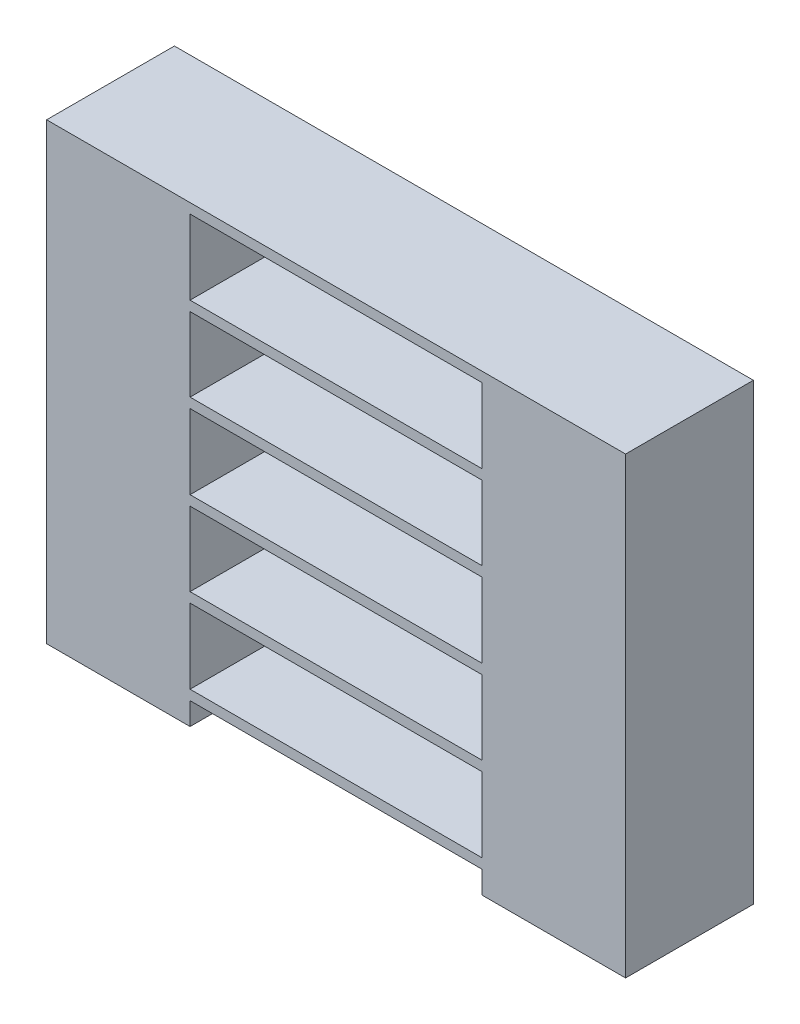
ISO-10303-21;
HEADER;
FILE_DESCRIPTION(('STEP AP214'),'2;1');
FILE_NAME('part.step','',(''),(''),'','','');
FILE_SCHEMA(('AUTOMOTIVE_DESIGN { 1 0 10303 214 1 1 1 1 }'));
ENDSEC;
DATA;
#1=APPLICATION_CONTEXT('core data for automotive mechanical design processes');
#2=APPLICATION_PROTOCOL_DEFINITION('international standard','automotive_design',2000,#1);
#3=PRODUCT_CONTEXT('',#1,'mechanical');
#4=PRODUCT('Part','Part','',(#3));
#5=PRODUCT_RELATED_PRODUCT_CATEGORY('part','',(#4));
#6=PRODUCT_DEFINITION_FORMATION('','',#4);
#7=PRODUCT_DEFINITION_CONTEXT('part definition',#1,'design');
#8=PRODUCT_DEFINITION('design','',#6,#7);
#9=PRODUCT_DEFINITION_SHAPE('','',#8);
#10=(LENGTH_UNIT() NAMED_UNIT(*) SI_UNIT(.MILLI.,.METRE.));
#11=(NAMED_UNIT(*) PLANE_ANGLE_UNIT() SI_UNIT($,.RADIAN.));
#12=(NAMED_UNIT(*) SI_UNIT($,.STERADIAN.) SOLID_ANGLE_UNIT());
#13=UNCERTAINTY_MEASURE_WITH_UNIT(LENGTH_MEASURE(1.E-05),#10,'distance_accuracy_value','');
#14=(GEOMETRIC_REPRESENTATION_CONTEXT(3) GLOBAL_UNCERTAINTY_ASSIGNED_CONTEXT((#13)) GLOBAL_UNIT_ASSIGNED_CONTEXT((#10,
#11,#12)) REPRESENTATION_CONTEXT('',''));
#15=CARTESIAN_POINT('',(0.,0.,0.));
#16=DIRECTION('',(0.,0.,1.));
#17=DIRECTION('',(1.,0.,0.));
#18=AXIS2_PLACEMENT_3D('',#15,#16,#17);
#19=CARTESIAN_POINT('',(1.19,-0.0999999999999999,0.22));
#20=DIRECTION('',(0.,-1.,0.));
#21=DIRECTION('',(0.,0.,-1.));
#22=AXIS2_PLACEMENT_3D('',#19,#20,#21);
#23=PLANE('',#22);
#24=DIRECTION('',(0.,0.,-1.));
#25=VECTOR('',#24,1.);
#26=CARTESIAN_POINT('',(0.05,-0.0999999999999999,1.41968162443208));
#27=LINE('',#26,#25);
#28=CARTESIAN_POINT('',(0.0499999999999999,-0.1,0.24));
#29=VERTEX_POINT('',#28);
#30=CARTESIAN_POINT('',(0.0499999999999999,-0.1,-0.22));
#31=VERTEX_POINT('',#30);
#32=EDGE_CURVE('E336',#29,#31,#27,.T.);
#33=ORIENTED_EDGE('',*,*,#32,.F.);
#34=DIRECTION('',(1.,0.,0.));
#35=VECTOR('',#34,1.);
#36=CARTESIAN_POINT('',(0.0499999999999999,-0.1,0.24));
#37=LINE('',#36,#35);
#38=CARTESIAN_POINT('',(1.17,-0.1,0.24));
#39=VERTEX_POINT('',#38);
#40=EDGE_CURVE('E292',#29,#39,#37,.T.);
#41=ORIENTED_EDGE('',*,*,#40,.T.);
#42=DIRECTION('',(0.,0.,-1.));
#43=VECTOR('',#42,1.);
#44=CARTESIAN_POINT('',(1.17,-0.0999999999999999,1.41968162443208));
#45=LINE('',#44,#43);
#46=CARTESIAN_POINT('',(1.17,-0.1,-0.22));
#47=VERTEX_POINT('',#46);
#48=EDGE_CURVE('E339',#39,#47,#45,.T.);
#49=ORIENTED_EDGE('',*,*,#48,.T.);
#50=DIRECTION('',(-1.,0.,0.));
#51=VECTOR('',#50,1.);
#52=CARTESIAN_POINT('',(1.19,-0.1,-0.22));
#53=LINE('',#52,#51);
#54=EDGE_CURVE('E455',#47,#31,#53,.T.);
#55=ORIENTED_EDGE('',*,*,#54,.T.);
#56=EDGE_LOOP('',(#33,#41,#49,#55));
#57=FACE_BOUND('',#56,.T.);
#58=ADVANCED_FACE('F35',(#57),#23,.F.);
#59=CARTESIAN_POINT('',(0.,0.,-0.22));
#60=DIRECTION('',(0.,0.,-1.));
#61=DIRECTION('',(0.,1.,0.));
#62=AXIS2_PLACEMENT_3D('',#59,#60,#61);
#63=PLANE('',#62);
#64=DIRECTION('',(0.,1.,0.));
#65=VECTOR('',#64,1.);
#66=CARTESIAN_POINT('',(0.05,-0.0799999999999999,-0.22));
#67=LINE('',#66,#65);
#68=CARTESIAN_POINT('',(0.05,0.186,-0.22));
#69=VERTEX_POINT('',#68);
#70=EDGE_CURVE('E55',#31,#69,#67,.T.);
#71=ORIENTED_EDGE('',*,*,#70,.F.);
#72=ORIENTED_EDGE('',*,*,#54,.F.);
#73=DIRECTION('',(0.,-1.,0.));
#74=VECTOR('',#73,1.);
#75=CARTESIAN_POINT('',(1.17,-0.0799999999999999,-0.22));
#76=LINE('',#75,#74);
#77=CARTESIAN_POINT('',(1.17,0.186,-0.22));
#78=VERTEX_POINT('',#77);
#79=EDGE_CURVE('E332',#78,#47,#76,.T.);
#80=ORIENTED_EDGE('',*,*,#79,.F.);
#81=DIRECTION('',(1.,0.,0.));
#82=VECTOR('',#81,1.);
#83=CARTESIAN_POINT('',(1.17,0.186,-0.22));
#84=LINE('',#83,#82);
#85=EDGE_CURVE('E50',#69,#78,#84,.T.);
#86=ORIENTED_EDGE('',*,*,#85,.F.);
#87=EDGE_LOOP('',(#71,#72,#80,#86));
#88=FACE_BOUND('',#87,.T.);
#89=ADVANCED_FACE('F488',(#88),#63,.F.);
#90=CARTESIAN_POINT('',(0.05,-0.0799999999999999,1.41968162443208));
#91=DIRECTION('',(-1.,0.,0.));
#92=DIRECTION('',(0.,0.,1.));
#93=AXIS2_PLACEMENT_3D('',#90,#91,#92);
#94=PLANE('',#93);
#95=DIRECTION('',(0.,0.,-1.));
#96=VECTOR('',#95,1.);
#97=CARTESIAN_POINT('',(0.05,0.186,1.41968162443208));
#98=LINE('',#97,#96);
#99=CARTESIAN_POINT('',(0.05,0.186,0.24));
#100=VERTEX_POINT('',#99);
#101=EDGE_CURVE('E344',#100,#69,#98,.T.);
#102=ORIENTED_EDGE('',*,*,#101,.F.);
#103=DIRECTION('',(0.,-1.,0.));
#104=VECTOR('',#103,1.);
#105=CARTESIAN_POINT('',(0.05,0.186,0.24));
#106=LINE('',#105,#104);
#107=EDGE_CURVE('E289',#100,#29,#106,.T.);
#108=ORIENTED_EDGE('',*,*,#107,.T.);
#109=ORIENTED_EDGE('',*,*,#32,.T.);
#110=ORIENTED_EDGE('',*,*,#70,.T.);
#111=EDGE_LOOP('',(#102,#108,#109,#110));
#112=FACE_BOUND('',#111,.T.);
#113=ADVANCED_FACE('F496',(#112),#94,.F.);
#114=CARTESIAN_POINT('',(1.17,-0.0799999999999999,1.41968162443208));
#115=DIRECTION('',(1.,0.,0.));
#116=DIRECTION('',(0.,0.,-1.));
#117=AXIS2_PLACEMENT_3D('',#114,#115,#116);
#118=PLANE('',#117);
#119=ORIENTED_EDGE('',*,*,#48,.F.);
#120=DIRECTION('',(0.,1.,0.));
#121=VECTOR('',#120,1.);
#122=CARTESIAN_POINT('',(1.17,-0.1,0.24));
#123=LINE('',#122,#121);
#124=CARTESIAN_POINT('',(1.17,0.186,0.24));
#125=VERTEX_POINT('',#124);
#126=EDGE_CURVE('E283',#39,#125,#123,.T.);
#127=ORIENTED_EDGE('',*,*,#126,.T.);
#128=DIRECTION('',(0.,0.,-1.));
#129=VECTOR('',#128,1.);
#130=CARTESIAN_POINT('',(1.17,0.186,1.41968162443208));
#131=LINE('',#130,#129);
#132=EDGE_CURVE('E341',#125,#78,#131,.T.);
#133=ORIENTED_EDGE('',*,*,#132,.T.);
#134=ORIENTED_EDGE('',*,*,#79,.T.);
#135=EDGE_LOOP('',(#119,#127,#133,#134));
#136=FACE_BOUND('',#135,.T.);
#137=ADVANCED_FACE('F581',(#136),#118,.F.);
#138=CARTESIAN_POINT('',(1.17,0.186,1.41968162443208));
#139=DIRECTION('',(0.,1.,0.));
#140=DIRECTION('',(0.,0.,1.));
#141=AXIS2_PLACEMENT_3D('',#138,#139,#140);
#142=PLANE('',#141);
#143=ORIENTED_EDGE('',*,*,#132,.F.);
#144=DIRECTION('',(-1.,0.,0.));
#145=VECTOR('',#144,1.);
#146=CARTESIAN_POINT('',(1.17,0.186,0.24));
#147=LINE('',#146,#145);
#148=EDGE_CURVE('E286',#125,#100,#147,.T.);
#149=ORIENTED_EDGE('',*,*,#148,.T.);
#150=ORIENTED_EDGE('',*,*,#101,.T.);
#151=ORIENTED_EDGE('',*,*,#85,.T.);
#152=EDGE_LOOP('',(#143,#149,#150,#151));
#153=FACE_BOUND('',#152,.T.);
#154=ADVANCED_FACE('F569',(#153),#142,.F.);
#155=CARTESIAN_POINT('',(0.,0.,0.24));
#156=DIRECTION('',(0.,0.,1.));
#157=DIRECTION('',(1.,0.,0.));
#158=AXIS2_PLACEMENT_3D('',#155,#156,#157);
#159=PLANE('',#158);
#160=DIRECTION('',(-1.,0.,0.));
#161=VECTOR('',#160,1.);
#162=CARTESIAN_POINT('',(1.22,0.87,0.24));
#163=LINE('',#162,#161);
#164=CARTESIAN_POINT('',(1.72,0.87,0.24));
#165=VERTEX_POINT('',#164);
#166=CARTESIAN_POINT('',(-0.5,0.87,0.24));
#167=VERTEX_POINT('',#166);
#168=EDGE_CURVE('E220',#165,#167,#163,.T.);
#169=ORIENTED_EDGE('',*,*,#168,.T.);
#170=DIRECTION('',(0.,1.,0.));
#171=VECTOR('',#170,1.);
#172=CARTESIAN_POINT('',(-0.5,-0.87,0.24));
#173=LINE('',#172,#171);
#174=CARTESIAN_POINT('',(-0.5,-0.87,0.24));
#175=VERTEX_POINT('',#174);
#176=EDGE_CURVE('E226',#175,#167,#173,.T.);
#177=ORIENTED_EDGE('',*,*,#176,.F.);
#178=DIRECTION('',(1.,0.,0.));
#179=VECTOR('',#178,1.);
#180=CARTESIAN_POINT('',(0.,-0.87,0.24));
#181=LINE('',#180,#179);
#182=CARTESIAN_POINT('',(0.05,-0.87,0.24));
#183=VERTEX_POINT('',#182);
#184=EDGE_CURVE('E319',#175,#183,#181,.T.);
#185=ORIENTED_EDGE('',*,*,#184,.T.);
#186=DIRECTION('',(0.,1.,0.));
#187=VECTOR('',#186,1.);
#188=CARTESIAN_POINT('',(0.05,-0.87,0.24));
#189=LINE('',#188,#187);
#190=CARTESIAN_POINT('',(0.0499999999999999,-0.784,0.24));
#191=VERTEX_POINT('',#190);
#192=EDGE_CURVE('E321',#183,#191,#189,.T.);
#193=ORIENTED_EDGE('',*,*,#192,.T.);
#194=DIRECTION('',(1.,0.,0.));
#195=VECTOR('',#194,1.);
#196=CARTESIAN_POINT('',(0.0499999999999999,-0.784,0.24));
#197=LINE('',#196,#195);
#198=CARTESIAN_POINT('',(1.17,-0.784,0.24));
#199=VERTEX_POINT('',#198);
#200=EDGE_CURVE('E324',#191,#199,#197,.T.);
#201=ORIENTED_EDGE('',*,*,#200,.T.);
#202=DIRECTION('',(0.,-1.,0.));
#203=VECTOR('',#202,1.);
#204=CARTESIAN_POINT('',(1.17,-0.784,0.24));
#205=LINE('',#204,#203);
#206=CARTESIAN_POINT('',(1.17,-0.87,0.24));
#207=VERTEX_POINT('',#206);
#208=EDGE_CURVE('E327',#199,#207,#205,.T.);
#209=ORIENTED_EDGE('',*,*,#208,.T.);
#210=DIRECTION('',(1.,0.,0.));
#211=VECTOR('',#210,1.);
#212=CARTESIAN_POINT('',(1.17,-0.87,0.24));
#213=LINE('',#212,#211);
#214=CARTESIAN_POINT('',(1.72,-0.87,0.24));
#215=VERTEX_POINT('',#214);
#216=EDGE_CURVE('E232',#207,#215,#213,.T.);
#217=ORIENTED_EDGE('',*,*,#216,.T.);
#218=DIRECTION('',(0.,-1.,0.));
#219=VECTOR('',#218,1.);
#220=CARTESIAN_POINT('',(1.72,0.87,0.24));
#221=LINE('',#220,#219);
#222=EDGE_CURVE('E228',#165,#215,#221,.T.);
#223=ORIENTED_EDGE('',*,*,#222,.F.);
#224=EDGE_LOOP('',(#169,#177,#185,#193,#201,#209,#217,#223));
#225=FACE_BOUND('',#224,.T.);
#226=DIRECTION('',(-1.,0.,0.));
#227=VECTOR('',#226,1.);
#228=CARTESIAN_POINT('',(1.17,0.832,0.24));
#229=LINE('',#228,#227);
#230=CARTESIAN_POINT('',(1.17,0.832,0.24));
#231=VERTEX_POINT('',#230);
#232=CARTESIAN_POINT('',(0.05,0.832,0.24));
#233=VERTEX_POINT('',#232);
#234=EDGE_CURVE('E310',#231,#233,#229,.T.);
#235=ORIENTED_EDGE('',*,*,#234,.F.);
#236=DIRECTION('',(0.,1.,0.));
#237=VECTOR('',#236,1.);
#238=CARTESIAN_POINT('',(1.17,0.546,0.24));
#239=LINE('',#238,#237);
#240=CARTESIAN_POINT('',(1.17,0.546,0.24));
#241=VERTEX_POINT('',#240);
#242=EDGE_CURVE('E307',#241,#231,#239,.T.);
#243=ORIENTED_EDGE('',*,*,#242,.F.);
#244=DIRECTION('',(1.,0.,0.));
#245=VECTOR('',#244,1.);
#246=CARTESIAN_POINT('',(0.0499999999999999,0.546,0.24));
#247=LINE('',#246,#245);
#248=CARTESIAN_POINT('',(0.0499999999999999,0.546,0.24));
#249=VERTEX_POINT('',#248);
#250=EDGE_CURVE('E316',#249,#241,#247,.T.);
#251=ORIENTED_EDGE('',*,*,#250,.F.);
#252=DIRECTION('',(0.,-1.,0.));
#253=VECTOR('',#252,1.);
#254=CARTESIAN_POINT('',(0.05,0.832,0.24));
#255=LINE('',#254,#253);
#256=EDGE_CURVE('E313',#233,#249,#255,.T.);
#257=ORIENTED_EDGE('',*,*,#256,.F.);
#258=EDGE_LOOP('',(#235,#243,#251,#257));
#259=FACE_BOUND('',#258,.T.);
#260=DIRECTION('',(-1.,0.,0.));
#261=VECTOR('',#260,1.);
#262=CARTESIAN_POINT('',(1.17,0.508,0.24));
#263=LINE('',#262,#261);
#264=CARTESIAN_POINT('',(1.17,0.508,0.24));
#265=VERTEX_POINT('',#264);
#266=CARTESIAN_POINT('',(0.05,0.508,0.24));
#267=VERTEX_POINT('',#266);
#268=EDGE_CURVE('E298',#265,#267,#263,.T.);
#269=ORIENTED_EDGE('',*,*,#268,.F.);
#270=DIRECTION('',(0.,1.,0.));
#271=VECTOR('',#270,1.);
#272=CARTESIAN_POINT('',(1.17,0.224,0.24));
#273=LINE('',#272,#271);
#274=CARTESIAN_POINT('',(1.17,0.224,0.24));
#275=VERTEX_POINT('',#274);
#276=EDGE_CURVE('E295',#275,#265,#273,.T.);
#277=ORIENTED_EDGE('',*,*,#276,.F.);
#278=DIRECTION('',(1.,0.,0.));
#279=VECTOR('',#278,1.);
#280=CARTESIAN_POINT('',(0.0499999999999999,0.224,0.24));
#281=LINE('',#280,#279);
#282=CARTESIAN_POINT('',(0.0499999999999999,0.224,0.24));
#283=VERTEX_POINT('',#282);
#284=EDGE_CURVE('E304',#283,#275,#281,.T.);
#285=ORIENTED_EDGE('',*,*,#284,.F.);
#286=DIRECTION('',(0.,-1.,0.));
#287=VECTOR('',#286,1.);
#288=CARTESIAN_POINT('',(0.05,0.508,0.24));
#289=LINE('',#288,#287);
#290=EDGE_CURVE('E301',#267,#283,#289,.T.);
#291=ORIENTED_EDGE('',*,*,#290,.F.);
#292=EDGE_LOOP('',(#269,#277,#285,#291));
#293=FACE_BOUND('',#292,.T.);
#294=ORIENTED_EDGE('',*,*,#148,.F.);
#295=ORIENTED_EDGE('',*,*,#126,.F.);
#296=ORIENTED_EDGE('',*,*,#40,.F.);
#297=ORIENTED_EDGE('',*,*,#107,.F.);
#298=EDGE_LOOP('',(#294,#295,#296,#297));
#299=FACE_BOUND('',#298,.T.);
#300=DIRECTION('',(-1.,0.,0.));
#301=VECTOR('',#300,1.);
#302=CARTESIAN_POINT('',(1.17,-0.138,0.24));
#303=LINE('',#302,#301);
#304=CARTESIAN_POINT('',(1.17,-0.138,0.24));
#305=VERTEX_POINT('',#304);
#306=CARTESIAN_POINT('',(0.05,-0.138,0.24));
#307=VERTEX_POINT('',#306);
#308=EDGE_CURVE('E274',#305,#307,#303,.T.);
#309=ORIENTED_EDGE('',*,*,#308,.F.);
#310=DIRECTION('',(0.,1.,0.));
#311=VECTOR('',#310,1.);
#312=CARTESIAN_POINT('',(1.17,-0.422,0.24));
#313=LINE('',#312,#311);
#314=CARTESIAN_POINT('',(1.17,-0.422,0.24));
#315=VERTEX_POINT('',#314);
#316=EDGE_CURVE('E271',#315,#305,#313,.T.);
#317=ORIENTED_EDGE('',*,*,#316,.F.);
#318=DIRECTION('',(1.,0.,0.));
#319=VECTOR('',#318,1.);
#320=CARTESIAN_POINT('',(0.0499999999999999,-0.422,0.24));
#321=LINE('',#320,#319);
#322=CARTESIAN_POINT('',(0.0499999999999999,-0.422,0.24));
#323=VERTEX_POINT('',#322);
#324=EDGE_CURVE('E280',#323,#315,#321,.T.);
#325=ORIENTED_EDGE('',*,*,#324,.F.);
#326=DIRECTION('',(0.,-1.,0.));
#327=VECTOR('',#326,1.);
#328=CARTESIAN_POINT('',(0.05,-0.138,0.24));
#329=LINE('',#328,#327);
#330=EDGE_CURVE('E277',#307,#323,#329,.T.);
#331=ORIENTED_EDGE('',*,*,#330,.F.);
#332=EDGE_LOOP('',(#309,#317,#325,#331));
#333=FACE_BOUND('',#332,.T.);
#334=DIRECTION('',(-1.,0.,0.));
#335=VECTOR('',#334,1.);
#336=CARTESIAN_POINT('',(1.17,-0.46,0.24));
#337=LINE('',#336,#335);
#338=CARTESIAN_POINT('',(1.17,-0.46,0.24));
#339=VERTEX_POINT('',#338);
#340=CARTESIAN_POINT('',(0.05,-0.46,0.24));
#341=VERTEX_POINT('',#340);
#342=EDGE_CURVE('E262',#339,#341,#337,.T.);
#343=ORIENTED_EDGE('',*,*,#342,.F.);
#344=DIRECTION('',(0.,1.,0.));
#345=VECTOR('',#344,1.);
#346=CARTESIAN_POINT('',(1.17,-0.746,0.24));
#347=LINE('',#346,#345);
#348=CARTESIAN_POINT('',(1.17,-0.746,0.24));
#349=VERTEX_POINT('',#348);
#350=EDGE_CURVE('E259',#349,#339,#347,.T.);
#351=ORIENTED_EDGE('',*,*,#350,.F.);
#352=DIRECTION('',(1.,0.,0.));
#353=VECTOR('',#352,1.);
#354=CARTESIAN_POINT('',(0.0499999999999999,-0.746,0.24));
#355=LINE('',#354,#353);
#356=CARTESIAN_POINT('',(0.0499999999999999,-0.746,0.24));
#357=VERTEX_POINT('',#356);
#358=EDGE_CURVE('E268',#357,#349,#355,.T.);
#359=ORIENTED_EDGE('',*,*,#358,.F.);
#360=DIRECTION('',(0.,-1.,0.));
#361=VECTOR('',#360,1.);
#362=CARTESIAN_POINT('',(0.05,-0.46,0.24));
#363=LINE('',#362,#361);
#364=EDGE_CURVE('E265',#341,#357,#363,.T.);
#365=ORIENTED_EDGE('',*,*,#364,.F.);
#366=EDGE_LOOP('',(#343,#351,#359,#365));
#367=FACE_BOUND('',#366,.T.);
#368=ADVANCED_FACE('F222',(#225,#259,#293,#299,#333,#367),#159,.T.);
#369=DIRECTION('',(0.,-1.,0.));
#370=VECTOR('',#369,1.);
#371=CARTESIAN_POINT('',(1.17,-0.784,-0.22));
#372=LINE('',#371,#370);
#373=CARTESIAN_POINT('',(1.17,-0.784,-0.22));
#374=VERTEX_POINT('',#373);
#375=CARTESIAN_POINT('',(1.17,-0.87,-0.22));
#376=VERTEX_POINT('',#375);
#377=EDGE_CURVE('E432',#374,#376,#372,.T.);
#378=ORIENTED_EDGE('',*,*,#377,.F.);
#379=DIRECTION('',(1.,0.,0.));
#380=VECTOR('',#379,1.);
#381=CARTESIAN_POINT('',(1.17,-0.784,-0.22));
#382=LINE('',#381,#380);
#383=CARTESIAN_POINT('',(0.05,-0.784,-0.22));
#384=VERTEX_POINT('',#383);
#385=EDGE_CURVE('E429',#384,#374,#382,.T.);
#386=ORIENTED_EDGE('',*,*,#385,.F.);
#387=DIRECTION('',(0.,1.,0.));
#388=VECTOR('',#387,1.);
#389=CARTESIAN_POINT('',(0.05,-0.784,-0.22));
#390=LINE('',#389,#388);
#391=CARTESIAN_POINT('',(0.05,-0.87,-0.22));
#392=VERTEX_POINT('',#391);
#393=EDGE_CURVE('E426',#392,#384,#390,.T.);
#394=ORIENTED_EDGE('',*,*,#393,.F.);
#395=DIRECTION('',(-1.,0.,0.));
#396=VECTOR('',#395,1.);
#397=CARTESIAN_POINT('',(1.22,-0.87,-0.22));
#398=LINE('',#397,#396);
#399=EDGE_CURVE('E443',#376,#392,#398,.T.);
#400=ORIENTED_EDGE('',*,*,#399,.F.);
#401=EDGE_LOOP('',(#378,#386,#394,#400));
#402=FACE_BOUND('',#401,.T.);
#403=ADVANCED_FACE('F537',(#402),#63,.F.);
#404=CARTESIAN_POINT('',(0.,0.,-0.25));
#405=DIRECTION('',(0.,0.,-1.));
#406=DIRECTION('',(0.,1.,0.));
#407=AXIS2_PLACEMENT_3D('',#404,#405,#406);
#408=PLANE('',#407);
#409=DIRECTION('',(1.,0.,0.));
#410=VECTOR('',#409,1.);
#411=CARTESIAN_POINT('',(1.22,0.87,-0.25));
#412=LINE('',#411,#410);
#413=CARTESIAN_POINT('',(-0.5,0.87,-0.25));
#414=VERTEX_POINT('',#413);
#415=CARTESIAN_POINT('',(1.72,0.87,-0.25));
#416=VERTEX_POINT('',#415);
#417=EDGE_CURVE('E236',#414,#416,#412,.T.);
#418=ORIENTED_EDGE('',*,*,#417,.T.);
#419=DIRECTION('',(0.,1.,0.));
#420=VECTOR('',#419,1.);
#421=CARTESIAN_POINT('',(1.72,-0.87,-0.25));
#422=LINE('',#421,#420);
#423=CARTESIAN_POINT('',(1.72,-0.87,-0.25));
#424=VERTEX_POINT('',#423);
#425=EDGE_CURVE('E250',#424,#416,#422,.T.);
#426=ORIENTED_EDGE('',*,*,#425,.F.);
#427=DIRECTION('',(-1.,0.,0.));
#428=VECTOR('',#427,1.);
#429=CARTESIAN_POINT('',(1.22,-0.87,-0.25));
#430=LINE('',#429,#428);
#431=CARTESIAN_POINT('',(-0.5,-0.87,-0.25));
#432=VERTEX_POINT('',#431);
#433=EDGE_CURVE('E444',#424,#432,#430,.T.);
#434=ORIENTED_EDGE('',*,*,#433,.T.);
#435=DIRECTION('',(0.,-1.,0.));
#436=VECTOR('',#435,1.);
#437=CARTESIAN_POINT('',(-0.5,0.87,-0.25));
#438=LINE('',#437,#436);
#439=EDGE_CURVE('E240',#414,#432,#438,.T.);
#440=ORIENTED_EDGE('',*,*,#439,.F.);
#441=EDGE_LOOP('',(#418,#426,#434,#440));
#442=FACE_BOUND('',#441,.T.);
#443=ADVANCED_FACE('F519',(#442),#408,.T.);
#444=CARTESIAN_POINT('',(0.03,0.87,0.22));
#445=DIRECTION('',(0.,-1.,0.));
#446=DIRECTION('',(0.,0.,-1.));
#447=AXIS2_PLACEMENT_3D('',#444,#445,#446);
#448=PLANE('',#447);
#449=ORIENTED_EDGE('',*,*,#417,.F.);
#450=DIRECTION('',(0.,0.,-1.));
#451=VECTOR('',#450,1.);
#452=CARTESIAN_POINT('',(-0.5,0.87,0.24));
#453=LINE('',#452,#451);
#454=EDGE_CURVE('E235',#167,#414,#453,.T.);
#455=ORIENTED_EDGE('',*,*,#454,.F.);
#456=ORIENTED_EDGE('',*,*,#168,.F.);
#457=DIRECTION('',(0.,0.,1.));
#458=VECTOR('',#457,1.);
#459=CARTESIAN_POINT('',(1.72,0.87,-0.25));
#460=LINE('',#459,#458);
#461=EDGE_CURVE('E253',#416,#165,#460,.T.);
#462=ORIENTED_EDGE('',*,*,#461,.F.);
#463=EDGE_LOOP('',(#449,#455,#456,#462));
#464=FACE_BOUND('',#463,.T.);
#465=ADVANCED_FACE('F37',(#464),#448,.F.);
#466=CARTESIAN_POINT('',(0.03,-0.87,0.22));
#467=DIRECTION('',(0.,1.,0.));
#468=DIRECTION('',(0.,0.,1.));
#469=AXIS2_PLACEMENT_3D('',#466,#467,#468);
#470=PLANE('',#469);
#471=ORIENTED_EDGE('',*,*,#184,.F.);
#472=DIRECTION('',(0.,0.,1.));
#473=VECTOR('',#472,1.);
#474=CARTESIAN_POINT('',(-0.5,-0.87,-0.25));
#475=LINE('',#474,#473);
#476=EDGE_CURVE('E245',#432,#175,#475,.T.);
#477=ORIENTED_EDGE('',*,*,#476,.F.);
#478=ORIENTED_EDGE('',*,*,#433,.F.);
#479=DIRECTION('',(0.,0.,-1.));
#480=VECTOR('',#479,1.);
#481=CARTESIAN_POINT('',(1.72,-0.87,0.24));
#482=LINE('',#481,#480);
#483=EDGE_CURVE('E256',#215,#424,#482,.T.);
#484=ORIENTED_EDGE('',*,*,#483,.F.);
#485=ORIENTED_EDGE('',*,*,#216,.F.);
#486=DIRECTION('',(0.,0.,-1.));
#487=VECTOR('',#486,1.);
#488=CARTESIAN_POINT('',(1.17,-0.87,1.41968162443208));
#489=LINE('',#488,#487);
#490=EDGE_CURVE('E435',#207,#376,#489,.T.);
#491=ORIENTED_EDGE('',*,*,#490,.T.);
#492=ORIENTED_EDGE('',*,*,#399,.T.);
#493=DIRECTION('',(0.,0.,-1.));
#494=VECTOR('',#493,1.);
#495=CARTESIAN_POINT('',(0.05,-0.87,1.41968162443208));
#496=LINE('',#495,#494);
#497=EDGE_CURVE('E441',#183,#392,#496,.T.);
#498=ORIENTED_EDGE('',*,*,#497,.F.);
#499=EDGE_LOOP('',(#471,#477,#478,#484,#485,#491,#492,#498));
#500=FACE_BOUND('',#499,.T.);
#501=ADVANCED_FACE('F508',(#500),#470,.F.);
#502=CARTESIAN_POINT('',(1.17,-0.784,1.41968162443208));
#503=DIRECTION('',(1.,0.,0.));
#504=DIRECTION('',(0.,0.,-1.));
#505=AXIS2_PLACEMENT_3D('',#502,#503,#504);
#506=PLANE('',#505);
#507=ORIENTED_EDGE('',*,*,#490,.F.);
#508=ORIENTED_EDGE('',*,*,#208,.F.);
#509=DIRECTION('',(0.,0.,-1.));
#510=VECTOR('',#509,1.);
#511=CARTESIAN_POINT('',(1.17,-0.784,1.41968162443208));
#512=LINE('',#511,#510);
#513=EDGE_CURVE('E437',#199,#374,#512,.T.);
#514=ORIENTED_EDGE('',*,*,#513,.T.);
#515=ORIENTED_EDGE('',*,*,#377,.T.);
#516=EDGE_LOOP('',(#507,#508,#514,#515));
#517=FACE_BOUND('',#516,.T.);
#518=ADVANCED_FACE('F510',(#517),#506,.F.);
#519=CARTESIAN_POINT('',(1.17,-0.784,1.41968162443208));
#520=DIRECTION('',(0.,1.,0.));
#521=DIRECTION('',(0.,0.,1.));
#522=AXIS2_PLACEMENT_3D('',#519,#520,#521);
#523=PLANE('',#522);
#524=ORIENTED_EDGE('',*,*,#513,.F.);
#525=ORIENTED_EDGE('',*,*,#200,.F.);
#526=DIRECTION('',(0.,0.,-1.));
#527=VECTOR('',#526,1.);
#528=CARTESIAN_POINT('',(0.05,-0.784,1.41968162443208));
#529=LINE('',#528,#527);
#530=EDGE_CURVE('E439',#191,#384,#529,.T.);
#531=ORIENTED_EDGE('',*,*,#530,.T.);
#532=ORIENTED_EDGE('',*,*,#385,.T.);
#533=EDGE_LOOP('',(#524,#525,#531,#532));
#534=FACE_BOUND('',#533,.T.);
#535=ADVANCED_FACE('F516',(#534),#523,.F.);
#536=CARTESIAN_POINT('',(0.05,-0.784,1.41968162443208));
#537=DIRECTION('',(-1.,0.,0.));
#538=DIRECTION('',(0.,0.,1.));
#539=AXIS2_PLACEMENT_3D('',#536,#537,#538);
#540=PLANE('',#539);
#541=ORIENTED_EDGE('',*,*,#530,.F.);
#542=ORIENTED_EDGE('',*,*,#192,.F.);
#543=ORIENTED_EDGE('',*,*,#497,.T.);
#544=ORIENTED_EDGE('',*,*,#393,.T.);
#545=EDGE_LOOP('',(#541,#542,#543,#544));
#546=FACE_BOUND('',#545,.T.);
#547=ADVANCED_FACE('F523',(#546),#540,.F.);
#548=DIRECTION('',(0.,-1.,0.));
#549=VECTOR('',#548,1.);
#550=CARTESIAN_POINT('',(1.17,-0.726,-0.22));
#551=LINE('',#550,#549);
#552=CARTESIAN_POINT('',(1.17,-0.46,-0.22));
#553=VERTEX_POINT('',#552);
#554=CARTESIAN_POINT('',(1.17,-0.746,-0.22));
#555=VERTEX_POINT('',#554);
#556=EDGE_CURVE('E412',#553,#555,#551,.T.);
#557=ORIENTED_EDGE('',*,*,#556,.F.);
#558=DIRECTION('',(1.,0.,0.));
#559=VECTOR('',#558,1.);
#560=CARTESIAN_POINT('',(1.17,-0.46,-0.22));
#561=LINE('',#560,#559);
#562=CARTESIAN_POINT('',(0.05,-0.46,-0.22));
#563=VERTEX_POINT('',#562);
#564=EDGE_CURVE('E409',#563,#553,#561,.T.);
#565=ORIENTED_EDGE('',*,*,#564,.F.);
#566=DIRECTION('',(0.,1.,0.));
#567=VECTOR('',#566,1.);
#568=CARTESIAN_POINT('',(0.05,-0.46,-0.22));
#569=LINE('',#568,#567);
#570=CARTESIAN_POINT('',(0.0499999999999999,-0.746,-0.22));
#571=VERTEX_POINT('',#570);
#572=EDGE_CURVE('E406',#571,#563,#569,.T.);
#573=ORIENTED_EDGE('',*,*,#572,.F.);
#574=DIRECTION('',(-1.,0.,0.));
#575=VECTOR('',#574,1.);
#576=CARTESIAN_POINT('',(1.19,-0.746,-0.22));
#577=LINE('',#576,#575);
#578=EDGE_CURVE('E11',#555,#571,#577,.T.);
#579=ORIENTED_EDGE('',*,*,#578,.F.);
#580=EDGE_LOOP('',(#557,#565,#573,#579));
#581=FACE_BOUND('',#580,.T.);
#582=ADVANCED_FACE('F484',(#581),#63,.F.);
#583=CARTESIAN_POINT('',(1.17,-0.46,1.41968162443208));
#584=DIRECTION('',(0.,1.,0.));
#585=DIRECTION('',(-1.,0.,0.));
#586=AXIS2_PLACEMENT_3D('',#583,#584,#585);
#587=PLANE('',#586);
#588=DIRECTION('',(0.,0.,-1.));
#589=VECTOR('',#588,1.);
#590=CARTESIAN_POINT('',(1.17,-0.46,1.41968162443208));
#591=LINE('',#590,#589);
#592=EDGE_CURVE('E420',#339,#553,#591,.T.);
#593=ORIENTED_EDGE('',*,*,#592,.F.);
#594=ORIENTED_EDGE('',*,*,#342,.T.);
#595=DIRECTION('',(0.,0.,-1.));
#596=VECTOR('',#595,1.);
#597=CARTESIAN_POINT('',(0.05,-0.46,1.41968162443208));
#598=LINE('',#597,#596);
#599=EDGE_CURVE('E423',#341,#563,#598,.T.);
#600=ORIENTED_EDGE('',*,*,#599,.T.);
#601=ORIENTED_EDGE('',*,*,#564,.T.);
#602=EDGE_LOOP('',(#593,#594,#600,#601));
#603=FACE_BOUND('',#602,.T.);
#604=ADVANCED_FACE('F771',(#603),#587,.F.);
#605=CARTESIAN_POINT('',(0.05,-0.46,1.41968162443208));
#606=DIRECTION('',(-1.,0.,0.));
#607=DIRECTION('',(0.,0.,1.));
#608=AXIS2_PLACEMENT_3D('',#605,#606,#607);
#609=PLANE('',#608);
#610=ORIENTED_EDGE('',*,*,#599,.F.);
#611=ORIENTED_EDGE('',*,*,#364,.T.);
#612=DIRECTION('',(0.,0.,-1.));
#613=VECTOR('',#612,1.);
#614=CARTESIAN_POINT('',(0.05,-0.746,1.41968162443208));
#615=LINE('',#614,#613);
#616=EDGE_CURVE('E415',#357,#571,#615,.T.);
#617=ORIENTED_EDGE('',*,*,#616,.T.);
#618=ORIENTED_EDGE('',*,*,#572,.T.);
#619=EDGE_LOOP('',(#610,#611,#617,#618));
#620=FACE_BOUND('',#619,.T.);
#621=ADVANCED_FACE('F506',(#620),#609,.F.);
#622=CARTESIAN_POINT('',(1.19,-0.746,0.22));
#623=DIRECTION('',(0.,-1.,0.));
#624=DIRECTION('',(0.,0.,-1.));
#625=AXIS2_PLACEMENT_3D('',#622,#623,#624);
#626=PLANE('',#625);
#627=DIRECTION('',(0.,0.,-1.));
#628=VECTOR('',#627,1.);
#629=CARTESIAN_POINT('',(1.17,-0.746,1.41968162443208));
#630=LINE('',#629,#628);
#631=EDGE_CURVE('E418',#349,#555,#630,.T.);
#632=ORIENTED_EDGE('',*,*,#631,.T.);
#633=ORIENTED_EDGE('',*,*,#578,.T.);
#634=ORIENTED_EDGE('',*,*,#616,.F.);
#635=ORIENTED_EDGE('',*,*,#358,.T.);
#636=EDGE_LOOP('',(#632,#633,#634,#635));
#637=FACE_BOUND('',#636,.T.);
#638=ADVANCED_FACE('F504',(#637),#626,.F.);
#639=CARTESIAN_POINT('',(1.17,-0.726,1.41968162443208));
#640=DIRECTION('',(1.,0.,0.));
#641=DIRECTION('',(0.,0.,-1.));
#642=AXIS2_PLACEMENT_3D('',#639,#640,#641);
#643=PLANE('',#642);
#644=ORIENTED_EDGE('',*,*,#631,.F.);
#645=ORIENTED_EDGE('',*,*,#350,.T.);
#646=ORIENTED_EDGE('',*,*,#592,.T.);
#647=ORIENTED_EDGE('',*,*,#556,.T.);
#648=EDGE_LOOP('',(#644,#645,#646,#647));
#649=FACE_BOUND('',#648,.T.);
#650=ADVANCED_FACE('F482',(#649),#643,.F.);
#651=DIRECTION('',(0.,-1.,0.));
#652=VECTOR('',#651,1.);
#653=CARTESIAN_POINT('',(1.17,-0.402,-0.22));
#654=LINE('',#653,#652);
#655=CARTESIAN_POINT('',(1.17,-0.138,-0.22));
#656=VERTEX_POINT('',#655);
#657=CARTESIAN_POINT('',(1.17,-0.422,-0.22));
#658=VERTEX_POINT('',#657);
#659=EDGE_CURVE('E392',#656,#658,#654,.T.);
#660=ORIENTED_EDGE('',*,*,#659,.F.);
#661=DIRECTION('',(1.,0.,0.));
#662=VECTOR('',#661,1.);
#663=CARTESIAN_POINT('',(1.17,-0.138,-0.22));
#664=LINE('',#663,#662);
#665=CARTESIAN_POINT('',(0.05,-0.138,-0.22));
#666=VERTEX_POINT('',#665);
#667=EDGE_CURVE('E389',#666,#656,#664,.T.);
#668=ORIENTED_EDGE('',*,*,#667,.F.);
#669=DIRECTION('',(0.,1.,0.));
#670=VECTOR('',#669,1.);
#671=CARTESIAN_POINT('',(0.05,-0.138,-0.22));
#672=LINE('',#671,#670);
#673=CARTESIAN_POINT('',(0.0499999999999999,-0.422,-0.22));
#674=VERTEX_POINT('',#673);
#675=EDGE_CURVE('E386',#674,#666,#672,.T.);
#676=ORIENTED_EDGE('',*,*,#675,.F.);
#677=DIRECTION('',(-1.,0.,0.));
#678=VECTOR('',#677,1.);
#679=CARTESIAN_POINT('',(1.19,-0.422,-0.22));
#680=LINE('',#679,#678);
#681=EDGE_CURVE('E43',#658,#674,#680,.T.);
#682=ORIENTED_EDGE('',*,*,#681,.F.);
#683=EDGE_LOOP('',(#660,#668,#676,#682));
#684=FACE_BOUND('',#683,.T.);
#685=ADVANCED_FACE('F471',(#684),#63,.F.);
#686=CARTESIAN_POINT('',(1.17,-0.138,1.41968162443208));
#687=DIRECTION('',(0.,1.,0.));
#688=DIRECTION('',(-1.,0.,0.));
#689=AXIS2_PLACEMENT_3D('',#686,#687,#688);
#690=PLANE('',#689);
#691=DIRECTION('',(0.,0.,-1.));
#692=VECTOR('',#691,1.);
#693=CARTESIAN_POINT('',(1.17,-0.138,1.41968162443208));
#694=LINE('',#693,#692);
#695=EDGE_CURVE('E400',#305,#656,#694,.T.);
#696=ORIENTED_EDGE('',*,*,#695,.F.);
#697=ORIENTED_EDGE('',*,*,#308,.T.);
#698=DIRECTION('',(0.,0.,-1.));
#699=VECTOR('',#698,1.);
#700=CARTESIAN_POINT('',(0.05,-0.138,1.41968162443208));
#701=LINE('',#700,#699);
#702=EDGE_CURVE('E403',#307,#666,#701,.T.);
#703=ORIENTED_EDGE('',*,*,#702,.T.);
#704=ORIENTED_EDGE('',*,*,#667,.T.);
#705=EDGE_LOOP('',(#696,#697,#703,#704));
#706=FACE_BOUND('',#705,.T.);
#707=ADVANCED_FACE('F473',(#706),#690,.F.);
#708=CARTESIAN_POINT('',(0.05,-0.138,1.41968162443208));
#709=DIRECTION('',(-1.,0.,0.));
#710=DIRECTION('',(0.,0.,1.));
#711=AXIS2_PLACEMENT_3D('',#708,#709,#710);
#712=PLANE('',#711);
#713=ORIENTED_EDGE('',*,*,#702,.F.);
#714=ORIENTED_EDGE('',*,*,#330,.T.);
#715=DIRECTION('',(0.,0.,-1.));
#716=VECTOR('',#715,1.);
#717=CARTESIAN_POINT('',(0.05,-0.422,1.41968162443208));
#718=LINE('',#717,#716);
#719=EDGE_CURVE('E395',#323,#674,#718,.T.);
#720=ORIENTED_EDGE('',*,*,#719,.T.);
#721=ORIENTED_EDGE('',*,*,#675,.T.);
#722=EDGE_LOOP('',(#713,#714,#720,#721));
#723=FACE_BOUND('',#722,.T.);
#724=ADVANCED_FACE('F462',(#723),#712,.F.);
#725=CARTESIAN_POINT('',(1.19,-0.422,0.22));
#726=DIRECTION('',(0.,-1.,0.));
#727=DIRECTION('',(0.,0.,-1.));
#728=AXIS2_PLACEMENT_3D('',#725,#726,#727);
#729=PLANE('',#728);
#730=DIRECTION('',(0.,0.,-1.));
#731=VECTOR('',#730,1.);
#732=CARTESIAN_POINT('',(1.17,-0.422,1.41968162443208));
#733=LINE('',#732,#731);
#734=EDGE_CURVE('E398',#315,#658,#733,.T.);
#735=ORIENTED_EDGE('',*,*,#734,.T.);
#736=ORIENTED_EDGE('',*,*,#681,.T.);
#737=ORIENTED_EDGE('',*,*,#719,.F.);
#738=ORIENTED_EDGE('',*,*,#324,.T.);
#739=EDGE_LOOP('',(#735,#736,#737,#738));
#740=FACE_BOUND('',#739,.T.);
#741=ADVANCED_FACE('F459',(#740),#729,.F.);
#742=CARTESIAN_POINT('',(1.17,-0.402,1.41968162443208));
#743=DIRECTION('',(1.,0.,0.));
#744=DIRECTION('',(0.,0.,-1.));
#745=AXIS2_PLACEMENT_3D('',#742,#743,#744);
#746=PLANE('',#745);
#747=ORIENTED_EDGE('',*,*,#734,.F.);
#748=ORIENTED_EDGE('',*,*,#316,.T.);
#749=ORIENTED_EDGE('',*,*,#695,.T.);
#750=ORIENTED_EDGE('',*,*,#659,.T.);
#751=EDGE_LOOP('',(#747,#748,#749,#750));
#752=FACE_BOUND('',#751,.T.);
#753=ADVANCED_FACE('F470',(#752),#746,.F.);
#754=DIRECTION('',(0.,-1.,0.));
#755=VECTOR('',#754,1.);
#756=CARTESIAN_POINT('',(1.17,0.566,-0.22));
#757=LINE('',#756,#755);
#758=CARTESIAN_POINT('',(1.17,0.832,-0.22));
#759=VERTEX_POINT('',#758);
#760=CARTESIAN_POINT('',(1.17,0.546,-0.22));
#761=VERTEX_POINT('',#760);
#762=EDGE_CURVE('E372',#759,#761,#757,.T.);
#763=ORIENTED_EDGE('',*,*,#762,.F.);
#764=DIRECTION('',(1.,0.,0.));
#765=VECTOR('',#764,1.);
#766=CARTESIAN_POINT('',(1.17,0.832,-0.22));
#767=LINE('',#766,#765);
#768=CARTESIAN_POINT('',(0.05,0.832,-0.22));
#769=VERTEX_POINT('',#768);
#770=EDGE_CURVE('E369',#769,#759,#767,.T.);
#771=ORIENTED_EDGE('',*,*,#770,.F.);
#772=DIRECTION('',(0.,1.,0.));
#773=VECTOR('',#772,1.);
#774=CARTESIAN_POINT('',(0.05,0.832,-0.22));
#775=LINE('',#774,#773);
#776=CARTESIAN_POINT('',(0.0499999999999999,0.546,-0.22));
#777=VERTEX_POINT('',#776);
#778=EDGE_CURVE('E366',#777,#769,#775,.T.);
#779=ORIENTED_EDGE('',*,*,#778,.F.);
#780=DIRECTION('',(-1.,0.,0.));
#781=VECTOR('',#780,1.);
#782=CARTESIAN_POINT('',(1.19,0.546,-0.22));
#783=LINE('',#782,#781);
#784=EDGE_CURVE('E447',#761,#777,#783,.T.);
#785=ORIENTED_EDGE('',*,*,#784,.F.);
#786=EDGE_LOOP('',(#763,#771,#779,#785));
#787=FACE_BOUND('',#786,.T.);
#788=ADVANCED_FACE('F497',(#787),#63,.F.);
#789=CARTESIAN_POINT('',(1.17,0.832,1.41968162443208));
#790=DIRECTION('',(0.,1.,0.));
#791=DIRECTION('',(-1.,0.,0.));
#792=AXIS2_PLACEMENT_3D('',#789,#790,#791);
#793=PLANE('',#792);
#794=DIRECTION('',(0.,0.,-1.));
#795=VECTOR('',#794,1.);
#796=CARTESIAN_POINT('',(1.17,0.832,1.41968162443208));
#797=LINE('',#796,#795);
#798=EDGE_CURVE('E380',#231,#759,#797,.T.);
#799=ORIENTED_EDGE('',*,*,#798,.F.);
#800=ORIENTED_EDGE('',*,*,#234,.T.);
#801=DIRECTION('',(0.,0.,-1.));
#802=VECTOR('',#801,1.);
#803=CARTESIAN_POINT('',(0.05,0.832,1.41968162443208));
#804=LINE('',#803,#802);
#805=EDGE_CURVE('E383',#233,#769,#804,.T.);
#806=ORIENTED_EDGE('',*,*,#805,.T.);
#807=ORIENTED_EDGE('',*,*,#770,.T.);
#808=EDGE_LOOP('',(#799,#800,#806,#807));
#809=FACE_BOUND('',#808,.T.);
#810=ADVANCED_FACE('F547',(#809),#793,.F.);
#811=CARTESIAN_POINT('',(0.05,0.832,1.41968162443208));
#812=DIRECTION('',(-1.,0.,0.));
#813=DIRECTION('',(0.,0.,1.));
#814=AXIS2_PLACEMENT_3D('',#811,#812,#813);
#815=PLANE('',#814);
#816=ORIENTED_EDGE('',*,*,#805,.F.);
#817=ORIENTED_EDGE('',*,*,#256,.T.);
#818=DIRECTION('',(0.,0.,-1.));
#819=VECTOR('',#818,1.);
#820=CARTESIAN_POINT('',(0.05,0.546,1.41968162443208));
#821=LINE('',#820,#819);
#822=EDGE_CURVE('E375',#249,#777,#821,.T.);
#823=ORIENTED_EDGE('',*,*,#822,.T.);
#824=ORIENTED_EDGE('',*,*,#778,.T.);
#825=EDGE_LOOP('',(#816,#817,#823,#824));
#826=FACE_BOUND('',#825,.T.);
#827=ADVANCED_FACE('F552',(#826),#815,.F.);
#828=CARTESIAN_POINT('',(1.19,0.546,0.22));
#829=DIRECTION('',(0.,-1.,0.));
#830=DIRECTION('',(0.,0.,-1.));
#831=AXIS2_PLACEMENT_3D('',#828,#829,#830);
#832=PLANE('',#831);
#833=DIRECTION('',(0.,0.,-1.));
#834=VECTOR('',#833,1.);
#835=CARTESIAN_POINT('',(1.17,0.546,1.41968162443208));
#836=LINE('',#835,#834);
#837=EDGE_CURVE('E378',#241,#761,#836,.T.);
#838=ORIENTED_EDGE('',*,*,#837,.T.);
#839=ORIENTED_EDGE('',*,*,#784,.T.);
#840=ORIENTED_EDGE('',*,*,#822,.F.);
#841=ORIENTED_EDGE('',*,*,#250,.T.);
#842=EDGE_LOOP('',(#838,#839,#840,#841));
#843=FACE_BOUND('',#842,.T.);
#844=ADVANCED_FACE('F549',(#843),#832,.F.);
#845=CARTESIAN_POINT('',(1.17,0.566,1.41968162443208));
#846=DIRECTION('',(1.,0.,0.));
#847=DIRECTION('',(0.,0.,-1.));
#848=AXIS2_PLACEMENT_3D('',#845,#846,#847);
#849=PLANE('',#848);
#850=ORIENTED_EDGE('',*,*,#837,.F.);
#851=ORIENTED_EDGE('',*,*,#242,.T.);
#852=ORIENTED_EDGE('',*,*,#798,.T.);
#853=ORIENTED_EDGE('',*,*,#762,.T.);
#854=EDGE_LOOP('',(#850,#851,#852,#853));
#855=FACE_BOUND('',#854,.T.);
#856=ADVANCED_FACE('F551',(#855),#849,.F.);
#857=DIRECTION('',(0.,1.,0.));
#858=VECTOR('',#857,1.);
#859=CARTESIAN_POINT('',(0.05,0.244,-0.22));
#860=LINE('',#859,#858);
#861=CARTESIAN_POINT('',(0.0499999999999999,0.224,-0.22));
#862=VERTEX_POINT('',#861);
#863=CARTESIAN_POINT('',(0.05,0.508,-0.22));
#864=VERTEX_POINT('',#863);
#865=EDGE_CURVE('E352',#862,#864,#860,.T.);
#866=ORIENTED_EDGE('',*,*,#865,.F.);
#867=DIRECTION('',(-1.,0.,0.));
#868=VECTOR('',#867,1.);
#869=CARTESIAN_POINT('',(1.19,0.224,-0.22));
#870=LINE('',#869,#868);
#871=CARTESIAN_POINT('',(1.17,0.224,-0.22));
#872=VERTEX_POINT('',#871);
#873=EDGE_CURVE('E452',#872,#862,#870,.T.);
#874=ORIENTED_EDGE('',*,*,#873,.F.);
#875=DIRECTION('',(0.,-1.,0.));
#876=VECTOR('',#875,1.);
#877=CARTESIAN_POINT('',(1.17,0.244,-0.22));
#878=LINE('',#877,#876);
#879=CARTESIAN_POINT('',(1.17,0.508,-0.22));
#880=VERTEX_POINT('',#879);
#881=EDGE_CURVE('E349',#880,#872,#878,.T.);
#882=ORIENTED_EDGE('',*,*,#881,.F.);
#883=DIRECTION('',(1.,0.,0.));
#884=VECTOR('',#883,1.);
#885=CARTESIAN_POINT('',(1.17,0.508,-0.22));
#886=LINE('',#885,#884);
#887=EDGE_CURVE('E346',#864,#880,#886,.T.);
#888=ORIENTED_EDGE('',*,*,#887,.F.);
#889=EDGE_LOOP('',(#866,#874,#882,#888));
#890=FACE_BOUND('',#889,.T.);
#891=ADVANCED_FACE('F485',(#890),#63,.F.);
#892=CARTESIAN_POINT('',(1.17,0.508,1.41968162443208));
#893=DIRECTION('',(0.,1.,0.));
#894=DIRECTION('',(-1.,0.,0.));
#895=AXIS2_PLACEMENT_3D('',#892,#893,#894);
#896=PLANE('',#895);
#897=DIRECTION('',(0.,0.,-1.));
#898=VECTOR('',#897,1.);
#899=CARTESIAN_POINT('',(1.17,0.508,1.41968162443208));
#900=LINE('',#899,#898);
#901=EDGE_CURVE('E360',#265,#880,#900,.T.);
#902=ORIENTED_EDGE('',*,*,#901,.F.);
#903=ORIENTED_EDGE('',*,*,#268,.T.);
#904=DIRECTION('',(0.,0.,-1.));
#905=VECTOR('',#904,1.);
#906=CARTESIAN_POINT('',(0.05,0.508,1.41968162443208));
#907=LINE('',#906,#905);
#908=EDGE_CURVE('E363',#267,#864,#907,.T.);
#909=ORIENTED_EDGE('',*,*,#908,.T.);
#910=ORIENTED_EDGE('',*,*,#887,.T.);
#911=EDGE_LOOP('',(#902,#903,#909,#910));
#912=FACE_BOUND('',#911,.T.);
#913=ADVANCED_FACE('F595',(#912),#896,.F.);
#914=CARTESIAN_POINT('',(0.05,0.244,1.41968162443208));
#915=DIRECTION('',(-1.,0.,0.));
#916=DIRECTION('',(0.,0.,1.));
#917=AXIS2_PLACEMENT_3D('',#914,#915,#916);
#918=PLANE('',#917);
#919=ORIENTED_EDGE('',*,*,#908,.F.);
#920=ORIENTED_EDGE('',*,*,#290,.T.);
#921=DIRECTION('',(0.,0.,-1.));
#922=VECTOR('',#921,1.);
#923=CARTESIAN_POINT('',(0.05,0.224,1.41968162443208));
#924=LINE('',#923,#922);
#925=EDGE_CURVE('E355',#283,#862,#924,.T.);
#926=ORIENTED_EDGE('',*,*,#925,.T.);
#927=ORIENTED_EDGE('',*,*,#865,.T.);
#928=EDGE_LOOP('',(#919,#920,#926,#927));
#929=FACE_BOUND('',#928,.T.);
#930=ADVANCED_FACE('F592',(#929),#918,.F.);
#931=CARTESIAN_POINT('',(1.19,0.224,0.22));
#932=DIRECTION('',(0.,-1.,0.));
#933=DIRECTION('',(0.,0.,-1.));
#934=AXIS2_PLACEMENT_3D('',#931,#932,#933);
#935=PLANE('',#934);
#936=ORIENTED_EDGE('',*,*,#925,.F.);
#937=ORIENTED_EDGE('',*,*,#284,.T.);
#938=DIRECTION('',(0.,0.,-1.));
#939=VECTOR('',#938,1.);
#940=CARTESIAN_POINT('',(1.17,0.224,1.41968162443208));
#941=LINE('',#940,#939);
#942=EDGE_CURVE('E358',#275,#872,#941,.T.);
#943=ORIENTED_EDGE('',*,*,#942,.T.);
#944=ORIENTED_EDGE('',*,*,#873,.T.);
#945=EDGE_LOOP('',(#936,#937,#943,#944));
#946=FACE_BOUND('',#945,.T.);
#947=ADVANCED_FACE('F500',(#946),#935,.F.);
#948=CARTESIAN_POINT('',(1.17,0.244,1.41968162443208));
#949=DIRECTION('',(1.,0.,0.));
#950=DIRECTION('',(0.,0.,-1.));
#951=AXIS2_PLACEMENT_3D('',#948,#949,#950);
#952=PLANE('',#951);
#953=ORIENTED_EDGE('',*,*,#942,.F.);
#954=ORIENTED_EDGE('',*,*,#276,.T.);
#955=ORIENTED_EDGE('',*,*,#901,.T.);
#956=ORIENTED_EDGE('',*,*,#881,.T.);
#957=EDGE_LOOP('',(#953,#954,#955,#956));
#958=FACE_BOUND('',#957,.T.);
#959=ADVANCED_FACE('F597',(#958),#952,.F.);
#960=CARTESIAN_POINT('',(1.72,0.,0.));
#961=DIRECTION('',(1.,0.,0.));
#962=DIRECTION('',(0.,0.,-1.));
#963=AXIS2_PLACEMENT_3D('',#960,#961,#962);
#964=PLANE('',#963);
#965=ORIENTED_EDGE('',*,*,#425,.T.);
#966=ORIENTED_EDGE('',*,*,#461,.T.);
#967=ORIENTED_EDGE('',*,*,#222,.T.);
#968=ORIENTED_EDGE('',*,*,#483,.T.);
#969=EDGE_LOOP('',(#965,#966,#967,#968));
#970=FACE_BOUND('',#969,.T.);
#971=ADVANCED_FACE('F533',(#970),#964,.T.);
#972=CARTESIAN_POINT('',(-0.5,0.,0.));
#973=DIRECTION('',(-1.,0.,0.));
#974=DIRECTION('',(0.,0.,1.));
#975=AXIS2_PLACEMENT_3D('',#972,#973,#974);
#976=PLANE('',#975);
#977=ORIENTED_EDGE('',*,*,#176,.T.);
#978=ORIENTED_EDGE('',*,*,#454,.T.);
#979=ORIENTED_EDGE('',*,*,#439,.T.);
#980=ORIENTED_EDGE('',*,*,#476,.T.);
#981=EDGE_LOOP('',(#977,#978,#979,#980));
#982=FACE_BOUND('',#981,.T.);
#983=ADVANCED_FACE('F243',(#982),#976,.T.);
#984=CLOSED_SHELL('',(#58,#89,#113,#137,#154,#368,#403,#443,#465,#501,#518,#535,#547,#582,#604,
#621,#638,#650,#685,#707,#724,#741,#753,#788,#810,#827,#844,#856,#891,#913,#930,#947,#959,#971,#983));
#985=MANIFOLD_SOLID_BREP('B2',#984);
#986=ADVANCED_BREP_SHAPE_REPRESENTATION('',(#18,#985),#14);
#987=SHAPE_DEFINITION_REPRESENTATION(#9,#986);
ENDSEC;
END-ISO-10303-21;
